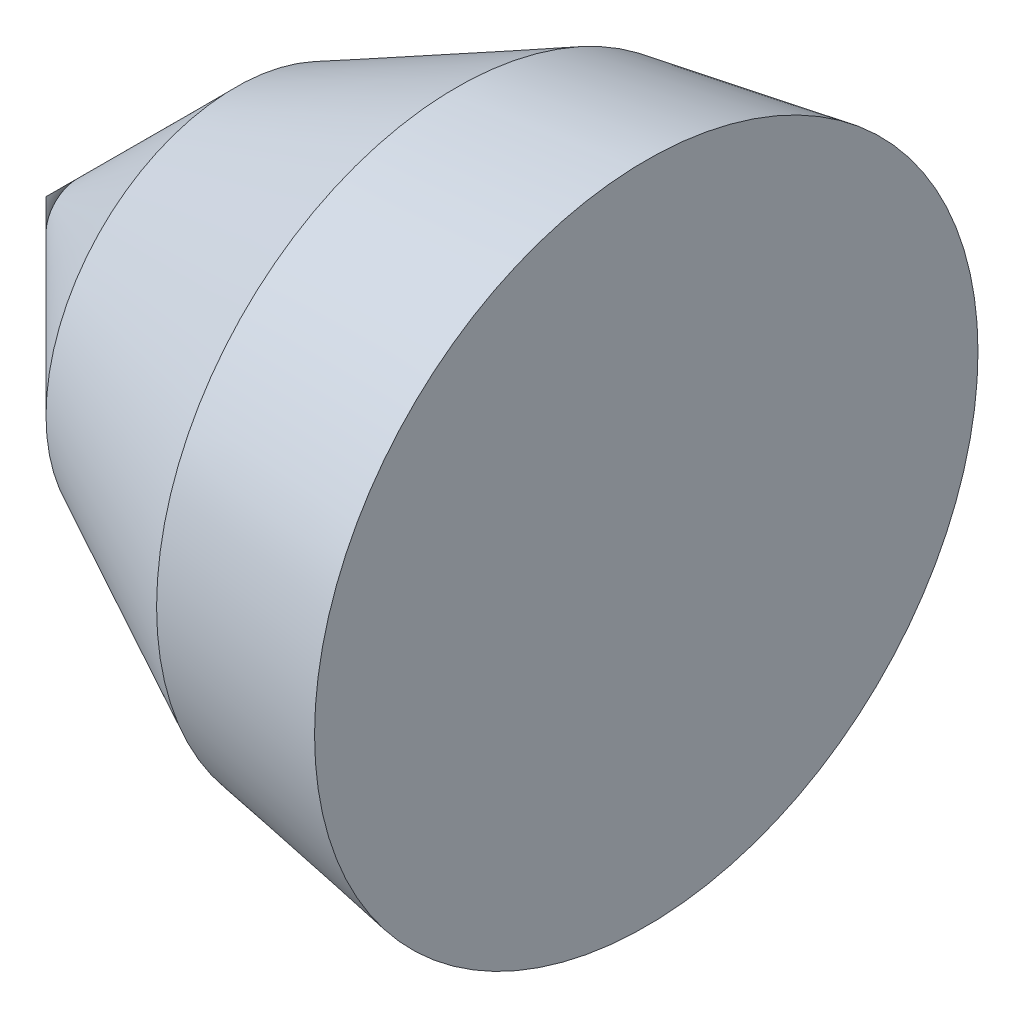
ISO-10303-21;
HEADER;
FILE_DESCRIPTION(('STEP AP214'),'2;1');
FILE_NAME('part.step','',(''),(''),'','','');
FILE_SCHEMA(('AUTOMOTIVE_DESIGN { 1 0 10303 214 1 1 1 1 }'));
ENDSEC;
DATA;
#1=APPLICATION_CONTEXT('core data for automotive mechanical design processes');
#2=APPLICATION_PROTOCOL_DEFINITION('international standard','automotive_design',2000,#1);
#3=PRODUCT_CONTEXT('',#1,'mechanical');
#4=PRODUCT('Part','Part','',(#3));
#5=PRODUCT_RELATED_PRODUCT_CATEGORY('part','',(#4));
#6=PRODUCT_DEFINITION_FORMATION('','',#4);
#7=PRODUCT_DEFINITION_CONTEXT('part definition',#1,'design');
#8=PRODUCT_DEFINITION('design','',#6,#7);
#9=PRODUCT_DEFINITION_SHAPE('','',#8);
#10=(LENGTH_UNIT() NAMED_UNIT(*) SI_UNIT(.MILLI.,.METRE.));
#11=(NAMED_UNIT(*) PLANE_ANGLE_UNIT() SI_UNIT($,.RADIAN.));
#12=(NAMED_UNIT(*) SI_UNIT($,.STERADIAN.) SOLID_ANGLE_UNIT());
#13=UNCERTAINTY_MEASURE_WITH_UNIT(LENGTH_MEASURE(1.E-05),#10,'distance_accuracy_value','');
#14=(GEOMETRIC_REPRESENTATION_CONTEXT(3) GLOBAL_UNCERTAINTY_ASSIGNED_CONTEXT((#13)) GLOBAL_UNIT_ASSIGNED_CONTEXT((#10,
#11,#12)) REPRESENTATION_CONTEXT('',''));
#15=CARTESIAN_POINT('',(0.,0.,0.));
#16=DIRECTION('',(0.,0.,1.));
#17=DIRECTION('',(1.,0.,0.));
#18=AXIS2_PLACEMENT_3D('',#15,#16,#17);
#19=CARTESIAN_POINT('',(0.,0.,0.));
#20=DIRECTION('',(-1.,0.,0.));
#21=DIRECTION('',(0.,0.,1.));
#22=AXIS2_PLACEMENT_3D('',#19,#20,#21);
#23=PLANE('',#22);
#24=CARTESIAN_POINT('',(0.,0.,0.));
#25=DIRECTION('',(-1.,0.,0.));
#26=DIRECTION('',(0.,0.,1.));
#27=AXIS2_PLACEMENT_3D('',#24,#25,#26);
#28=CIRCLE('',#27,21.);
#29=CARTESIAN_POINT('',(0.,0.,21.));
#30=VERTEX_POINT('',#29);
#31=EDGE_CURVE('E11',#30,#30,#28,.T.);
#32=ORIENTED_EDGE('',*,*,#31,.F.);
#33=EDGE_LOOP('',(#32));
#34=FACE_BOUND('',#33,.T.);
#35=ADVANCED_FACE('F39',(#34),#23,.F.);
#36=CARTESIAN_POINT('',(0.,0.,0.));
#37=DIRECTION('',(1.,0.,0.));
#38=DIRECTION('',(0.,0.,-1.));
#39=AXIS2_PLACEMENT_3D('',#36,#37,#38);
#40=CONICAL_SURFACE('',#39,21.,0.165148677414627);
#41=CARTESIAN_POINT('',(-12.,0.,0.));
#42=DIRECTION('',(-1.,0.,0.));
#43=DIRECTION('',(0.,0.,1.));
#44=AXIS2_PLACEMENT_3D('',#41,#42,#43);
#45=CIRCLE('',#44,19.);
#46=CARTESIAN_POINT('',(-12.,0.,19.));
#47=VERTEX_POINT('',#46);
#48=EDGE_CURVE('E45',#47,#47,#45,.T.);
#49=ORIENTED_EDGE('',*,*,#48,.F.);
#50=EDGE_LOOP('',(#49));
#51=FACE_BOUND('',#50,.T.);
#52=ORIENTED_EDGE('',*,*,#31,.T.);
#53=EDGE_LOOP('',(#52));
#54=FACE_BOUND('',#53,.T.);
#55=ADVANCED_FACE('F62',(#51,#54),#40,.T.);
#56=CARTESIAN_POINT('',(-12.,0.,0.));
#57=DIRECTION('',(1.,0.,0.));
#58=DIRECTION('',(0.,0.,-1.));
#59=AXIS2_PLACEMENT_3D('',#56,#57,#58);
#60=CONICAL_SURFACE('',#59,19.,0.463647609000806);
#61=CARTESIAN_POINT('',(-26.,0.,0.));
#62=DIRECTION('',(-1.,0.,0.));
#63=DIRECTION('',(0.,0.,1.));
#64=AXIS2_PLACEMENT_3D('',#61,#62,#63);
#65=CIRCLE('',#64,12.);
#66=CARTESIAN_POINT('',(-26.,0.,12.));
#67=VERTEX_POINT('',#66);
#68=EDGE_CURVE('E55',#67,#67,#65,.T.);
#69=ORIENTED_EDGE('',*,*,#68,.F.);
#70=EDGE_LOOP('',(#69));
#71=FACE_BOUND('',#70,.T.);
#72=ORIENTED_EDGE('',*,*,#48,.T.);
#73=EDGE_LOOP('',(#72));
#74=FACE_BOUND('',#73,.T.);
#75=ADVANCED_FACE('F51',(#71,#74),#60,.T.);
#76=CARTESIAN_POINT('',(-26.,0.,0.));
#77=DIRECTION('',(1.,0.,0.));
#78=DIRECTION('',(0.,0.,-1.));
#79=AXIS2_PLACEMENT_3D('',#76,#77,#78);
#80=CONICAL_SURFACE('',#79,12.,0.785398163397449);
#81=CARTESIAN_POINT('',(-38.,0.,0.));
#82=VERTEX_POINT('',#81);
#83=VERTEX_LOOP('',#82);
#84=FACE_BOUND('',#83,.T.);
#85=ORIENTED_EDGE('',*,*,#68,.T.);
#86=EDGE_LOOP('',(#85));
#87=FACE_BOUND('',#86,.T.);
#88=ADVANCED_FACE('F48',(#84,#87),#80,.T.);
#89=CLOSED_SHELL('',(#35,#55,#75,#88));
#90=MANIFOLD_SOLID_BREP('B2',#89);
#91=ADVANCED_BREP_SHAPE_REPRESENTATION('',(#18,#90),#14);
#92=SHAPE_DEFINITION_REPRESENTATION(#9,#91);
ENDSEC;
END-ISO-10303-21;
